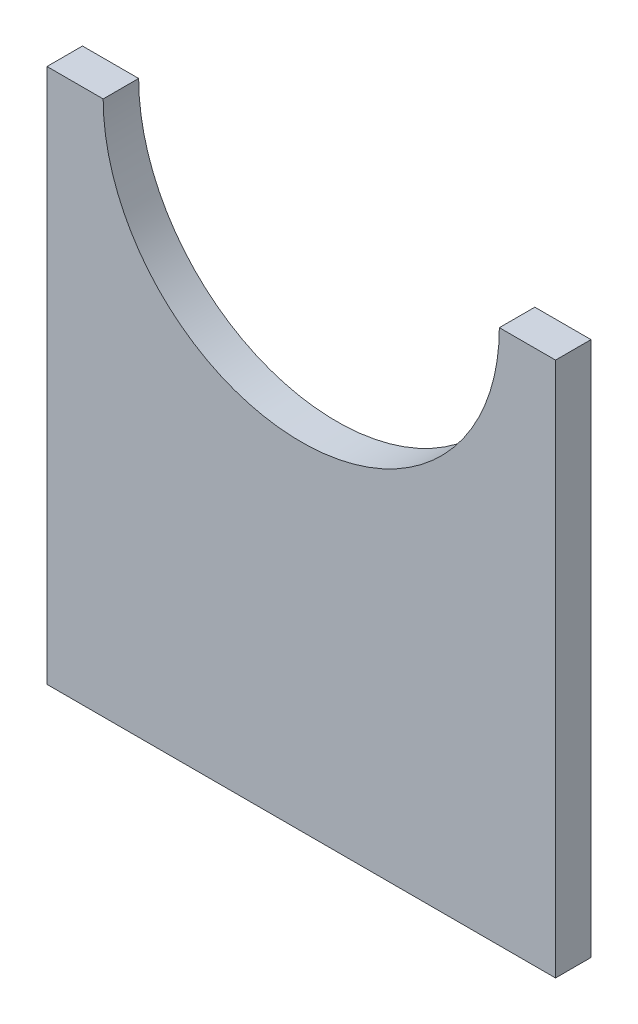
ISO-10303-21;
HEADER;
FILE_DESCRIPTION(('STEP AP214'),'2;1');
FILE_NAME('part.step','',(''),(''),'','','');
FILE_SCHEMA(('AUTOMOTIVE_DESIGN { 1 0 10303 214 1 1 1 1 }'));
ENDSEC;
DATA;
#1=APPLICATION_CONTEXT('core data for automotive mechanical design processes');
#2=APPLICATION_PROTOCOL_DEFINITION('international standard','automotive_design',2000,#1);
#3=PRODUCT_CONTEXT('',#1,'mechanical');
#4=PRODUCT('Part','Part','',(#3));
#5=PRODUCT_RELATED_PRODUCT_CATEGORY('part','',(#4));
#6=PRODUCT_DEFINITION_FORMATION('','',#4);
#7=PRODUCT_DEFINITION_CONTEXT('part definition',#1,'design');
#8=PRODUCT_DEFINITION('design','',#6,#7);
#9=PRODUCT_DEFINITION_SHAPE('','',#8);
#10=(LENGTH_UNIT() NAMED_UNIT(*) SI_UNIT(.MILLI.,.METRE.));
#11=(NAMED_UNIT(*) PLANE_ANGLE_UNIT() SI_UNIT($,.RADIAN.));
#12=(NAMED_UNIT(*) SI_UNIT($,.STERADIAN.) SOLID_ANGLE_UNIT());
#13=UNCERTAINTY_MEASURE_WITH_UNIT(LENGTH_MEASURE(1.E-05),#10,'distance_accuracy_value','');
#14=(GEOMETRIC_REPRESENTATION_CONTEXT(3) GLOBAL_UNCERTAINTY_ASSIGNED_CONTEXT((#13)) GLOBAL_UNIT_ASSIGNED_CONTEXT((#10,
#11,#12)) REPRESENTATION_CONTEXT('',''));
#15=CARTESIAN_POINT('',(0.,0.,0.));
#16=DIRECTION('',(0.,0.,1.));
#17=DIRECTION('',(1.,0.,0.));
#18=AXIS2_PLACEMENT_3D('',#15,#16,#17);
#19=CARTESIAN_POINT('',(-21.5,0.,3.));
#20=DIRECTION('',(1.,0.,0.));
#21=DIRECTION('',(0.,1.,0.));
#22=AXIS2_PLACEMENT_3D('',#19,#20,#21);
#23=PLANE('',#22);
#24=DIRECTION('',(0.,-1.,0.));
#25=VECTOR('',#24,1.);
#26=CARTESIAN_POINT('',(-21.5,0.,0.));
#27=LINE('',#26,#25);
#28=CARTESIAN_POINT('',(-21.5,0.,0.));
#29=VERTEX_POINT('',#28);
#30=CARTESIAN_POINT('',(-21.5,-45.25,0.));
#31=VERTEX_POINT('',#30);
#32=EDGE_CURVE('E120',#29,#31,#27,.T.);
#33=ORIENTED_EDGE('',*,*,#32,.T.);
#34=DIRECTION('',(0.,0.,-1.));
#35=VECTOR('',#34,1.);
#36=CARTESIAN_POINT('',(-21.5,-45.25,3.));
#37=LINE('',#36,#35);
#38=CARTESIAN_POINT('',(-21.5,-45.25,3.));
#39=VERTEX_POINT('',#38);
#40=EDGE_CURVE('E11',#39,#31,#37,.T.);
#41=ORIENTED_EDGE('',*,*,#40,.F.);
#42=DIRECTION('',(0.,-1.,0.));
#43=VECTOR('',#42,1.);
#44=CARTESIAN_POINT('',(-21.5,0.,3.));
#45=LINE('',#44,#43);
#46=CARTESIAN_POINT('',(-21.5,0.,3.));
#47=VERTEX_POINT('',#46);
#48=EDGE_CURVE('E130',#47,#39,#45,.T.);
#49=ORIENTED_EDGE('',*,*,#48,.F.);
#50=DIRECTION('',(0.,0.,-1.));
#51=VECTOR('',#50,1.);
#52=CARTESIAN_POINT('',(-21.5,0.,3.));
#53=LINE('',#52,#51);
#54=EDGE_CURVE('E116',#47,#29,#53,.T.);
#55=ORIENTED_EDGE('',*,*,#54,.T.);
#56=EDGE_LOOP('',(#33,#41,#49,#55));
#57=FACE_BOUND('',#56,.T.);
#58=ADVANCED_FACE('F36',(#57),#23,.F.);
#59=CARTESIAN_POINT('',(5.00000000000001,-45.25,3.));
#60=DIRECTION('',(0.,1.,0.));
#61=DIRECTION('',(0.,0.,1.));
#62=AXIS2_PLACEMENT_3D('',#59,#60,#61);
#63=PLANE('',#62);
#64=DIRECTION('',(1.,0.,0.));
#65=VECTOR('',#64,1.);
#66=CARTESIAN_POINT('',(5.00000000000001,-45.25,0.));
#67=LINE('',#66,#65);
#68=CARTESIAN_POINT('',(21.5,-45.25,0.));
#69=VERTEX_POINT('',#68);
#70=EDGE_CURVE('E123',#31,#69,#67,.T.);
#71=ORIENTED_EDGE('',*,*,#70,.T.);
#72=DIRECTION('',(0.,0.,-1.));
#73=VECTOR('',#72,1.);
#74=CARTESIAN_POINT('',(21.5,-45.25,3.));
#75=LINE('',#74,#73);
#76=CARTESIAN_POINT('',(21.5,-45.25,3.));
#77=VERTEX_POINT('',#76);
#78=EDGE_CURVE('E44',#77,#69,#75,.T.);
#79=ORIENTED_EDGE('',*,*,#78,.F.);
#80=DIRECTION('',(1.,0.,0.));
#81=VECTOR('',#80,1.);
#82=CARTESIAN_POINT('',(-21.5,-45.25,3.));
#83=LINE('',#82,#81);
#84=EDGE_CURVE('E89',#39,#77,#83,.T.);
#85=ORIENTED_EDGE('',*,*,#84,.F.);
#86=ORIENTED_EDGE('',*,*,#40,.T.);
#87=EDGE_LOOP('',(#71,#79,#85,#86));
#88=FACE_BOUND('',#87,.T.);
#89=ADVANCED_FACE('F154',(#88),#63,.F.);
#90=CARTESIAN_POINT('',(21.5,0.,3.));
#91=DIRECTION('',(-1.,0.,0.));
#92=DIRECTION('',(0.,-1.,0.));
#93=AXIS2_PLACEMENT_3D('',#90,#91,#92);
#94=PLANE('',#93);
#95=DIRECTION('',(0.,1.,0.));
#96=VECTOR('',#95,1.);
#97=CARTESIAN_POINT('',(21.5,0.,0.));
#98=LINE('',#97,#96);
#99=CARTESIAN_POINT('',(21.5,0.,0.));
#100=VERTEX_POINT('',#99);
#101=EDGE_CURVE('E125',#69,#100,#98,.T.);
#102=ORIENTED_EDGE('',*,*,#101,.T.);
#103=DIRECTION('',(0.,0.,-1.));
#104=VECTOR('',#103,1.);
#105=CARTESIAN_POINT('',(21.5,0.,3.));
#106=LINE('',#105,#104);
#107=CARTESIAN_POINT('',(21.5,0.,3.));
#108=VERTEX_POINT('',#107);
#109=EDGE_CURVE('E111',#108,#100,#106,.T.);
#110=ORIENTED_EDGE('',*,*,#109,.F.);
#111=DIRECTION('',(0.,1.,0.));
#112=VECTOR('',#111,1.);
#113=CARTESIAN_POINT('',(21.5,0.,3.));
#114=LINE('',#113,#112);
#115=EDGE_CURVE('E102',#77,#108,#114,.T.);
#116=ORIENTED_EDGE('',*,*,#115,.F.);
#117=ORIENTED_EDGE('',*,*,#78,.T.);
#118=EDGE_LOOP('',(#102,#110,#116,#117));
#119=FACE_BOUND('',#118,.T.);
#120=ADVANCED_FACE('F136',(#119),#94,.F.);
#121=CARTESIAN_POINT('',(16.75,0.,3.));
#122=DIRECTION('',(0.,-1.,0.));
#123=DIRECTION('',(1.,0.,0.));
#124=AXIS2_PLACEMENT_3D('',#121,#122,#123);
#125=PLANE('',#124);
#126=DIRECTION('',(-1.,0.,0.));
#127=VECTOR('',#126,1.);
#128=CARTESIAN_POINT('',(16.75,0.,0.));
#129=LINE('',#128,#127);
#130=CARTESIAN_POINT('',(16.75,0.,0.));
#131=VERTEX_POINT('',#130);
#132=EDGE_CURVE('E110',#100,#131,#129,.T.);
#133=ORIENTED_EDGE('',*,*,#132,.T.);
#134=DIRECTION('',(0.,0.,-1.));
#135=VECTOR('',#134,1.);
#136=CARTESIAN_POINT('',(16.75,0.,3.));
#137=LINE('',#136,#135);
#138=CARTESIAN_POINT('',(16.75,0.,3.));
#139=VERTEX_POINT('',#138);
#140=EDGE_CURVE('E107',#139,#131,#137,.T.);
#141=ORIENTED_EDGE('',*,*,#140,.F.);
#142=DIRECTION('',(-1.,0.,0.));
#143=VECTOR('',#142,1.);
#144=CARTESIAN_POINT('',(16.75,0.,3.));
#145=LINE('',#144,#143);
#146=EDGE_CURVE('E96',#108,#139,#145,.T.);
#147=ORIENTED_EDGE('',*,*,#146,.F.);
#148=ORIENTED_EDGE('',*,*,#109,.T.);
#149=EDGE_LOOP('',(#133,#141,#147,#148));
#150=FACE_BOUND('',#149,.T.);
#151=ADVANCED_FACE('F108',(#150),#125,.F.);
#152=CARTESIAN_POINT('',(0.,0.,3.));
#153=DIRECTION('',(0.,0.,-1.));
#154=DIRECTION('',(-1.,0.,0.));
#155=AXIS2_PLACEMENT_3D('',#152,#153,#154);
#156=CYLINDRICAL_SURFACE('',#155,16.75);
#157=CARTESIAN_POINT('',(0.,0.,0.));
#158=DIRECTION('',(0.,0.,-1.));
#159=DIRECTION('',(1.,0.,0.));
#160=AXIS2_PLACEMENT_3D('',#157,#158,#159);
#161=CIRCLE('',#160,16.75);
#162=CARTESIAN_POINT('',(-16.75,0.,0.));
#163=VERTEX_POINT('',#162);
#164=EDGE_CURVE('E75',#131,#163,#161,.T.);
#165=ORIENTED_EDGE('',*,*,#164,.T.);
#166=DIRECTION('',(0.,0.,-1.));
#167=VECTOR('',#166,1.);
#168=CARTESIAN_POINT('',(-16.75,0.,3.));
#169=LINE('',#168,#167);
#170=CARTESIAN_POINT('',(-16.75,0.,3.));
#171=VERTEX_POINT('',#170);
#172=EDGE_CURVE('E112',#171,#163,#169,.T.);
#173=ORIENTED_EDGE('',*,*,#172,.F.);
#174=CARTESIAN_POINT('',(0.,0.,3.));
#175=DIRECTION('',(0.,0.,-1.));
#176=DIRECTION('',(1.,0.,0.));
#177=AXIS2_PLACEMENT_3D('',#174,#175,#176);
#178=CIRCLE('',#177,16.75);
#179=EDGE_CURVE('E100',#139,#171,#178,.T.);
#180=ORIENTED_EDGE('',*,*,#179,.F.);
#181=ORIENTED_EDGE('',*,*,#140,.T.);
#182=EDGE_LOOP('',(#165,#173,#180,#181));
#183=FACE_BOUND('',#182,.T.);
#184=ADVANCED_FACE('F114',(#183),#156,.F.);
#185=CARTESIAN_POINT('',(-16.75,0.,3.));
#186=DIRECTION('',(0.,-1.,0.));
#187=DIRECTION('',(1.,0.,0.));
#188=AXIS2_PLACEMENT_3D('',#185,#186,#187);
#189=PLANE('',#188);
#190=DIRECTION('',(-1.,0.,0.));
#191=VECTOR('',#190,1.);
#192=CARTESIAN_POINT('',(-16.75,0.,0.));
#193=LINE('',#192,#191);
#194=EDGE_CURVE('E81',#163,#29,#193,.T.);
#195=ORIENTED_EDGE('',*,*,#194,.T.);
#196=ORIENTED_EDGE('',*,*,#54,.F.);
#197=DIRECTION('',(-1.,0.,0.));
#198=VECTOR('',#197,1.);
#199=CARTESIAN_POINT('',(-16.75,0.,3.));
#200=LINE('',#199,#198);
#201=EDGE_CURVE('E52',#171,#47,#200,.T.);
#202=ORIENTED_EDGE('',*,*,#201,.F.);
#203=ORIENTED_EDGE('',*,*,#172,.T.);
#204=EDGE_LOOP('',(#195,#196,#202,#203));
#205=FACE_BOUND('',#204,.T.);
#206=ADVANCED_FACE('F143',(#205),#189,.F.);
#207=CARTESIAN_POINT('',(0.,0.,3.));
#208=DIRECTION('',(0.,0.,1.));
#209=DIRECTION('',(1.,0.,0.));
#210=AXIS2_PLACEMENT_3D('',#207,#208,#209);
#211=PLANE('',#210);
#212=ORIENTED_EDGE('',*,*,#48,.T.);
#213=ORIENTED_EDGE('',*,*,#84,.T.);
#214=ORIENTED_EDGE('',*,*,#115,.T.);
#215=ORIENTED_EDGE('',*,*,#146,.T.);
#216=ORIENTED_EDGE('',*,*,#179,.T.);
#217=ORIENTED_EDGE('',*,*,#201,.T.);
#218=EDGE_LOOP('',(#212,#213,#214,#215,#216,#217));
#219=FACE_BOUND('',#218,.T.);
#220=ADVANCED_FACE('F98',(#219),#211,.T.);
#221=CARTESIAN_POINT('',(0.,0.,0.));
#222=DIRECTION('',(0.,0.,1.));
#223=DIRECTION('',(1.,0.,0.));
#224=AXIS2_PLACEMENT_3D('',#221,#222,#223);
#225=PLANE('',#224);
#226=ORIENTED_EDGE('',*,*,#32,.F.);
#227=ORIENTED_EDGE('',*,*,#194,.F.);
#228=ORIENTED_EDGE('',*,*,#164,.F.);
#229=ORIENTED_EDGE('',*,*,#132,.F.);
#230=ORIENTED_EDGE('',*,*,#101,.F.);
#231=ORIENTED_EDGE('',*,*,#70,.F.);
#232=EDGE_LOOP('',(#226,#227,#228,#229,#230,#231));
#233=FACE_BOUND('',#232,.T.);
#234=ADVANCED_FACE('F139',(#233),#225,.F.);
#235=CLOSED_SHELL('',(#58,#89,#120,#151,#184,#206,#220,#234));
#236=MANIFOLD_SOLID_BREP('B2',#235);
#237=ADVANCED_BREP_SHAPE_REPRESENTATION('',(#18,#236),#14);
#238=SHAPE_DEFINITION_REPRESENTATION(#9,#237);
ENDSEC;
END-ISO-10303-21;
